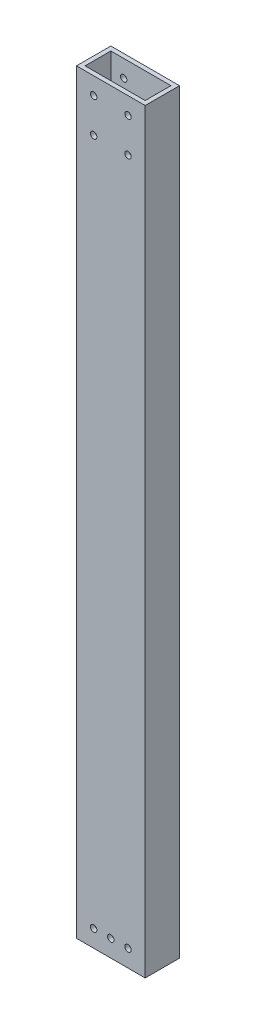
ISO-10303-21;
HEADER;
FILE_DESCRIPTION(('STEP AP214'),'2;1');
FILE_NAME('part.step','',(''),(''),'','','');
FILE_SCHEMA(('AUTOMOTIVE_DESIGN { 1 0 10303 214 1 1 1 1 }'));
ENDSEC;
DATA;
#1=APPLICATION_CONTEXT('core data for automotive mechanical design processes');
#2=APPLICATION_PROTOCOL_DEFINITION('international standard','automotive_design',2000,#1);
#3=PRODUCT_CONTEXT('',#1,'mechanical');
#4=PRODUCT('Part','Part','',(#3));
#5=PRODUCT_RELATED_PRODUCT_CATEGORY('part','',(#4));
#6=PRODUCT_DEFINITION_FORMATION('','',#4);
#7=PRODUCT_DEFINITION_CONTEXT('part definition',#1,'design');
#8=PRODUCT_DEFINITION('design','',#6,#7);
#9=PRODUCT_DEFINITION_SHAPE('','',#8);
#10=(LENGTH_UNIT() NAMED_UNIT(*) SI_UNIT(.MILLI.,.METRE.));
#11=(NAMED_UNIT(*) PLANE_ANGLE_UNIT() SI_UNIT($,.RADIAN.));
#12=(NAMED_UNIT(*) SI_UNIT($,.STERADIAN.) SOLID_ANGLE_UNIT());
#13=UNCERTAINTY_MEASURE_WITH_UNIT(LENGTH_MEASURE(1.E-05),#10,'distance_accuracy_value','');
#14=(GEOMETRIC_REPRESENTATION_CONTEXT(3) GLOBAL_UNCERTAINTY_ASSIGNED_CONTEXT((#13)) GLOBAL_UNIT_ASSIGNED_CONTEXT((#10,
#11,#12)) REPRESENTATION_CONTEXT('',''));
#15=CARTESIAN_POINT('',(0.,0.,0.));
#16=DIRECTION('',(0.,0.,1.));
#17=DIRECTION('',(1.,0.,0.));
#18=AXIS2_PLACEMENT_3D('',#15,#16,#17);
#19=CARTESIAN_POINT('',(0.,279.4,0.));
#20=DIRECTION('',(0.,-1.,0.));
#21=DIRECTION('',(0.,0.,-1.));
#22=AXIS2_PLACEMENT_3D('',#19,#20,#21);
#23=PLANE('',#22);
#24=DIRECTION('',(0.,0.,1.));
#25=VECTOR('',#24,1.);
#26=CARTESIAN_POINT('',(-25.4,279.4,-12.7));
#27=LINE('',#26,#25);
#28=CARTESIAN_POINT('',(-25.4,279.4,-12.7));
#29=VERTEX_POINT('',#28);
#30=CARTESIAN_POINT('',(-25.4,279.4,12.7));
#31=VERTEX_POINT('',#30);
#32=EDGE_CURVE('E136',#29,#31,#27,.T.);
#33=ORIENTED_EDGE('',*,*,#32,.T.);
#34=DIRECTION('',(1.,0.,0.));
#35=VECTOR('',#34,1.);
#36=CARTESIAN_POINT('',(25.4,279.4,12.7));
#37=LINE('',#36,#35);
#38=CARTESIAN_POINT('',(25.4,279.4,12.7));
#39=VERTEX_POINT('',#38);
#40=EDGE_CURVE('E139',#31,#39,#37,.T.);
#41=ORIENTED_EDGE('',*,*,#40,.T.);
#42=DIRECTION('',(0.,0.,-1.));
#43=VECTOR('',#42,1.);
#44=CARTESIAN_POINT('',(25.4,279.4,-12.7));
#45=LINE('',#44,#43);
#46=CARTESIAN_POINT('',(25.4,279.4,-12.7));
#47=VERTEX_POINT('',#46);
#48=EDGE_CURVE('E142',#39,#47,#45,.T.);
#49=ORIENTED_EDGE('',*,*,#48,.T.);
#50=DIRECTION('',(-1.,0.,0.));
#51=VECTOR('',#50,1.);
#52=CARTESIAN_POINT('',(25.4,279.4,-12.7));
#53=LINE('',#52,#51);
#54=EDGE_CURVE('E144',#47,#29,#53,.T.);
#55=ORIENTED_EDGE('',*,*,#54,.T.);
#56=EDGE_LOOP('',(#33,#41,#49,#55));
#57=FACE_BOUND('',#56,.T.);
#58=DIRECTION('',(0.,0.,1.));
#59=VECTOR('',#58,1.);
#60=CARTESIAN_POINT('',(-22.225,279.4,0.));
#61=LINE('',#60,#59);
#62=CARTESIAN_POINT('',(-22.225,279.4,-9.52500000000001));
#63=VERTEX_POINT('',#62);
#64=CARTESIAN_POINT('',(-22.225,279.4,9.52500000000001));
#65=VERTEX_POINT('',#64);
#66=EDGE_CURVE('E124',#63,#65,#61,.T.);
#67=ORIENTED_EDGE('',*,*,#66,.F.);
#68=DIRECTION('',(-1.,0.,0.));
#69=VECTOR('',#68,1.);
#70=CARTESIAN_POINT('',(0.,279.4,-9.52500000000001));
#71=LINE('',#70,#69);
#72=CARTESIAN_POINT('',(22.225,279.4,-9.52500000000001));
#73=VERTEX_POINT('',#72);
#74=EDGE_CURVE('E108',#73,#63,#71,.T.);
#75=ORIENTED_EDGE('',*,*,#74,.F.);
#76=DIRECTION('',(0.,0.,-1.));
#77=VECTOR('',#76,1.);
#78=CARTESIAN_POINT('',(22.225,279.4,0.));
#79=LINE('',#78,#77);
#80=CARTESIAN_POINT('',(22.225,279.4,9.52500000000001));
#81=VERTEX_POINT('',#80);
#82=EDGE_CURVE('E133',#81,#73,#79,.T.);
#83=ORIENTED_EDGE('',*,*,#82,.F.);
#84=DIRECTION('',(1.,0.,0.));
#85=VECTOR('',#84,1.);
#86=CARTESIAN_POINT('',(0.,279.4,9.52500000000001));
#87=LINE('',#86,#85);
#88=EDGE_CURVE('E126',#65,#81,#87,.T.);
#89=ORIENTED_EDGE('',*,*,#88,.F.);
#90=EDGE_LOOP('',(#67,#75,#83,#89));
#91=FACE_BOUND('',#90,.T.);
#92=ADVANCED_FACE('F36',(#57,#91),#23,.F.);
#93=CARTESIAN_POINT('',(0.,-279.4,0.));
#94=DIRECTION('',(0.,-1.,0.));
#95=DIRECTION('',(0.,0.,-1.));
#96=AXIS2_PLACEMENT_3D('',#93,#94,#95);
#97=PLANE('',#96);
#98=DIRECTION('',(0.,0.,1.));
#99=VECTOR('',#98,1.);
#100=CARTESIAN_POINT('',(-25.4,-279.4,-12.7));
#101=LINE('',#100,#99);
#102=CARTESIAN_POINT('',(-25.4,-279.4,-12.7));
#103=VERTEX_POINT('',#102);
#104=CARTESIAN_POINT('',(-25.4,-279.4,12.7));
#105=VERTEX_POINT('',#104);
#106=EDGE_CURVE('E147',#103,#105,#101,.T.);
#107=ORIENTED_EDGE('',*,*,#106,.F.);
#108=DIRECTION('',(-1.,0.,0.));
#109=VECTOR('',#108,1.);
#110=CARTESIAN_POINT('',(25.4,-279.4,-12.7));
#111=LINE('',#110,#109);
#112=CARTESIAN_POINT('',(25.4,-279.4,-12.7));
#113=VERTEX_POINT('',#112);
#114=EDGE_CURVE('E140',#113,#103,#111,.T.);
#115=ORIENTED_EDGE('',*,*,#114,.F.);
#116=DIRECTION('',(0.,0.,-1.));
#117=VECTOR('',#116,1.);
#118=CARTESIAN_POINT('',(25.4,-279.4,-12.7));
#119=LINE('',#118,#117);
#120=CARTESIAN_POINT('',(25.4,-279.4,12.7));
#121=VERTEX_POINT('',#120);
#122=EDGE_CURVE('E152',#121,#113,#119,.T.);
#123=ORIENTED_EDGE('',*,*,#122,.F.);
#124=DIRECTION('',(1.,0.,0.));
#125=VECTOR('',#124,1.);
#126=CARTESIAN_POINT('',(25.4,-279.4,12.7));
#127=LINE('',#126,#125);
#128=EDGE_CURVE('E150',#105,#121,#127,.T.);
#129=ORIENTED_EDGE('',*,*,#128,.F.);
#130=EDGE_LOOP('',(#107,#115,#123,#129));
#131=FACE_BOUND('',#130,.T.);
#132=DIRECTION('',(-1.,0.,0.));
#133=VECTOR('',#132,1.);
#134=CARTESIAN_POINT('',(0.,-279.4,-9.52500000000001));
#135=LINE('',#134,#133);
#136=CARTESIAN_POINT('',(22.225,-279.4,-9.52500000000001));
#137=VERTEX_POINT('',#136);
#138=CARTESIAN_POINT('',(-22.225,-279.4,-9.52500000000001));
#139=VERTEX_POINT('',#138);
#140=EDGE_CURVE('E106',#137,#139,#135,.T.);
#141=ORIENTED_EDGE('',*,*,#140,.T.);
#142=DIRECTION('',(0.,0.,1.));
#143=VECTOR('',#142,1.);
#144=CARTESIAN_POINT('',(-22.225,-279.4,0.));
#145=LINE('',#144,#143);
#146=CARTESIAN_POINT('',(-22.225,-279.4,9.52500000000001));
#147=VERTEX_POINT('',#146);
#148=EDGE_CURVE('E114',#139,#147,#145,.T.);
#149=ORIENTED_EDGE('',*,*,#148,.T.);
#150=DIRECTION('',(1.,0.,0.));
#151=VECTOR('',#150,1.);
#152=CARTESIAN_POINT('',(0.,-279.4,9.52500000000001));
#153=LINE('',#152,#151);
#154=CARTESIAN_POINT('',(22.225,-279.4,9.52500000000001));
#155=VERTEX_POINT('',#154);
#156=EDGE_CURVE('E120',#147,#155,#153,.T.);
#157=ORIENTED_EDGE('',*,*,#156,.T.);
#158=DIRECTION('',(0.,0.,-1.));
#159=VECTOR('',#158,1.);
#160=CARTESIAN_POINT('',(22.225,-279.4,0.));
#161=LINE('',#160,#159);
#162=EDGE_CURVE('E60',#155,#137,#161,.T.);
#163=ORIENTED_EDGE('',*,*,#162,.T.);
#164=EDGE_LOOP('',(#141,#149,#157,#163));
#165=FACE_BOUND('',#164,.T.);
#166=ADVANCED_FACE('F123',(#131,#165),#97,.T.);
#167=CARTESIAN_POINT('',(-25.4,279.4,-12.7));
#168=DIRECTION('',(1.,0.,0.));
#169=DIRECTION('',(0.,0.,-1.));
#170=AXIS2_PLACEMENT_3D('',#167,#168,#169);
#171=PLANE('',#170);
#172=ORIENTED_EDGE('',*,*,#106,.T.);
#173=DIRECTION('',(0.,-1.,0.));
#174=VECTOR('',#173,1.);
#175=CARTESIAN_POINT('',(-25.4,279.4,12.7));
#176=LINE('',#175,#174);
#177=EDGE_CURVE('E11',#31,#105,#176,.T.);
#178=ORIENTED_EDGE('',*,*,#177,.F.);
#179=ORIENTED_EDGE('',*,*,#32,.F.);
#180=DIRECTION('',(0.,-1.,0.));
#181=VECTOR('',#180,1.);
#182=CARTESIAN_POINT('',(-25.4,279.4,-12.7));
#183=LINE('',#182,#181);
#184=EDGE_CURVE('E146',#29,#103,#183,.T.);
#185=ORIENTED_EDGE('',*,*,#184,.T.);
#186=EDGE_LOOP('',(#172,#178,#179,#185));
#187=FACE_BOUND('',#186,.T.);
#188=ADVANCED_FACE('F38',(#187),#171,.F.);
#189=CARTESIAN_POINT('',(25.4,279.4,12.7));
#190=DIRECTION('',(0.,0.,-1.));
#191=DIRECTION('',(-1.,0.,0.));
#192=AXIS2_PLACEMENT_3D('',#189,#190,#191);
#193=PLANE('',#192);
#194=CARTESIAN_POINT('',(0.,-266.7,12.7));
#195=DIRECTION('',(0.,0.,-1.));
#196=DIRECTION('',(-1.,0.,0.));
#197=AXIS2_PLACEMENT_3D('',#194,#195,#196);
#198=CIRCLE('',#197,2.38125000000001);
#199=CARTESIAN_POINT('',(-2.38125000000001,-266.7,12.7));
#200=VERTEX_POINT('',#199);
#201=EDGE_CURVE('E246',#200,#200,#198,.T.);
#202=ORIENTED_EDGE('',*,*,#201,.T.);
#203=EDGE_LOOP('',(#202));
#204=FACE_BOUND('',#203,.T.);
#205=CARTESIAN_POINT('',(-12.7,-266.7,12.7));
#206=DIRECTION('',(0.,0.,-1.));
#207=DIRECTION('',(-1.,0.,0.));
#208=AXIS2_PLACEMENT_3D('',#205,#206,#207);
#209=CIRCLE('',#208,2.38125000000002);
#210=CARTESIAN_POINT('',(-15.08125,-266.7,12.7));
#211=VERTEX_POINT('',#210);
#212=EDGE_CURVE('E250',#211,#211,#209,.T.);
#213=ORIENTED_EDGE('',*,*,#212,.T.);
#214=EDGE_LOOP('',(#213));
#215=FACE_BOUND('',#214,.T.);
#216=CARTESIAN_POINT('',(12.7,266.7,12.7));
#217=DIRECTION('',(0.,0.,-1.));
#218=DIRECTION('',(-1.,0.,0.));
#219=AXIS2_PLACEMENT_3D('',#216,#217,#218);
#220=CIRCLE('',#219,2.38125000000004);
#221=CARTESIAN_POINT('',(10.31875,266.7,12.7));
#222=VERTEX_POINT('',#221);
#223=EDGE_CURVE('E254',#222,#222,#220,.T.);
#224=ORIENTED_EDGE('',*,*,#223,.T.);
#225=EDGE_LOOP('',(#224));
#226=FACE_BOUND('',#225,.T.);
#227=CARTESIAN_POINT('',(12.7,241.3,12.7));
#228=DIRECTION('',(0.,0.,-1.));
#229=DIRECTION('',(-1.,0.,0.));
#230=AXIS2_PLACEMENT_3D('',#227,#228,#229);
#231=CIRCLE('',#230,2.38125);
#232=CARTESIAN_POINT('',(10.31875,241.3,12.7));
#233=VERTEX_POINT('',#232);
#234=EDGE_CURVE('E258',#233,#233,#231,.T.);
#235=ORIENTED_EDGE('',*,*,#234,.T.);
#236=EDGE_LOOP('',(#235));
#237=FACE_BOUND('',#236,.T.);
#238=CARTESIAN_POINT('',(-12.7,241.3,12.7));
#239=DIRECTION('',(0.,0.,-1.));
#240=DIRECTION('',(-1.,0.,0.));
#241=AXIS2_PLACEMENT_3D('',#238,#239,#240);
#242=CIRCLE('',#241,2.38125);
#243=CARTESIAN_POINT('',(-15.08125,241.3,12.7));
#244=VERTEX_POINT('',#243);
#245=EDGE_CURVE('E262',#244,#244,#242,.T.);
#246=ORIENTED_EDGE('',*,*,#245,.T.);
#247=EDGE_LOOP('',(#246));
#248=FACE_BOUND('',#247,.T.);
#249=CARTESIAN_POINT('',(-12.7,266.7,12.7));
#250=DIRECTION('',(0.,0.,-1.));
#251=DIRECTION('',(-1.,0.,0.));
#252=AXIS2_PLACEMENT_3D('',#249,#250,#251);
#253=CIRCLE('',#252,2.38125000000004);
#254=CARTESIAN_POINT('',(-15.08125,266.7,12.7));
#255=VERTEX_POINT('',#254);
#256=EDGE_CURVE('E266',#255,#255,#253,.T.);
#257=ORIENTED_EDGE('',*,*,#256,.T.);
#258=EDGE_LOOP('',(#257));
#259=FACE_BOUND('',#258,.T.);
#260=CARTESIAN_POINT('',(12.7,-266.7,12.7));
#261=DIRECTION('',(0.,0.,-1.));
#262=DIRECTION('',(-1.,0.,0.));
#263=AXIS2_PLACEMENT_3D('',#260,#261,#262);
#264=CIRCLE('',#263,2.38125000000002);
#265=CARTESIAN_POINT('',(10.31875,-266.7,12.7));
#266=VERTEX_POINT('',#265);
#267=EDGE_CURVE('E166',#266,#266,#264,.T.);
#268=ORIENTED_EDGE('',*,*,#267,.T.);
#269=EDGE_LOOP('',(#268));
#270=FACE_BOUND('',#269,.T.);
#271=ORIENTED_EDGE('',*,*,#128,.T.);
#272=DIRECTION('',(0.,-1.,0.));
#273=VECTOR('',#272,1.);
#274=CARTESIAN_POINT('',(25.4,279.4,12.7));
#275=LINE('',#274,#273);
#276=EDGE_CURVE('E45',#39,#121,#275,.T.);
#277=ORIENTED_EDGE('',*,*,#276,.F.);
#278=ORIENTED_EDGE('',*,*,#40,.F.);
#279=ORIENTED_EDGE('',*,*,#177,.T.);
#280=EDGE_LOOP('',(#271,#277,#278,#279));
#281=FACE_BOUND('',#280,.T.);
#282=ADVANCED_FACE('F234',(#204,#215,#226,#237,#248,#259,#270,#281),#193,.F.);
#283=CARTESIAN_POINT('',(25.4,279.4,-12.7));
#284=DIRECTION('',(-1.,0.,0.));
#285=DIRECTION('',(0.,0.,1.));
#286=AXIS2_PLACEMENT_3D('',#283,#284,#285);
#287=PLANE('',#286);
#288=ORIENTED_EDGE('',*,*,#122,.T.);
#289=DIRECTION('',(0.,-1.,0.));
#290=VECTOR('',#289,1.);
#291=CARTESIAN_POINT('',(25.4,279.4,-12.7));
#292=LINE('',#291,#290);
#293=EDGE_CURVE('E157',#47,#113,#292,.T.);
#294=ORIENTED_EDGE('',*,*,#293,.F.);
#295=ORIENTED_EDGE('',*,*,#48,.F.);
#296=ORIENTED_EDGE('',*,*,#276,.T.);
#297=EDGE_LOOP('',(#288,#294,#295,#296));
#298=FACE_BOUND('',#297,.T.);
#299=ADVANCED_FACE('F231',(#298),#287,.F.);
#300=CARTESIAN_POINT('',(25.4,279.4,-12.7));
#301=DIRECTION('',(0.,0.,1.));
#302=DIRECTION('',(1.,0.,0.));
#303=AXIS2_PLACEMENT_3D('',#300,#301,#302);
#304=PLANE('',#303);
#305=CARTESIAN_POINT('',(0.,-266.7,-12.7));
#306=DIRECTION('',(0.,0.,-1.));
#307=DIRECTION('',(-1.,0.,0.));
#308=AXIS2_PLACEMENT_3D('',#305,#306,#307);
#309=CIRCLE('',#308,2.38125000000001);
#310=CARTESIAN_POINT('',(-2.38125000000001,-266.7,-12.7));
#311=VERTEX_POINT('',#310);
#312=EDGE_CURVE('E285',#311,#311,#309,.T.);
#313=ORIENTED_EDGE('',*,*,#312,.F.);
#314=EDGE_LOOP('',(#313));
#315=FACE_BOUND('',#314,.T.);
#316=CARTESIAN_POINT('',(-12.7,-266.7,-12.7));
#317=DIRECTION('',(0.,0.,-1.));
#318=DIRECTION('',(-1.,0.,0.));
#319=AXIS2_PLACEMENT_3D('',#316,#317,#318);
#320=CIRCLE('',#319,2.38125000000002);
#321=CARTESIAN_POINT('',(-15.08125,-266.7,-12.7));
#322=VERTEX_POINT('',#321);
#323=EDGE_CURVE('E362',#322,#322,#320,.T.);
#324=ORIENTED_EDGE('',*,*,#323,.F.);
#325=EDGE_LOOP('',(#324));
#326=FACE_BOUND('',#325,.T.);
#327=CARTESIAN_POINT('',(12.7,266.7,-12.7));
#328=DIRECTION('',(0.,0.,-1.));
#329=DIRECTION('',(-1.,0.,0.));
#330=AXIS2_PLACEMENT_3D('',#327,#328,#329);
#331=CIRCLE('',#330,2.38125000000004);
#332=CARTESIAN_POINT('',(10.31875,266.7,-12.7));
#333=VERTEX_POINT('',#332);
#334=EDGE_CURVE('E366',#333,#333,#331,.T.);
#335=ORIENTED_EDGE('',*,*,#334,.F.);
#336=EDGE_LOOP('',(#335));
#337=FACE_BOUND('',#336,.T.);
#338=CARTESIAN_POINT('',(12.7,241.3,-12.7));
#339=DIRECTION('',(0.,0.,-1.));
#340=DIRECTION('',(-1.,0.,0.));
#341=AXIS2_PLACEMENT_3D('',#338,#339,#340);
#342=CIRCLE('',#341,2.38125);
#343=CARTESIAN_POINT('',(10.31875,241.3,-12.7));
#344=VERTEX_POINT('',#343);
#345=EDGE_CURVE('E369',#344,#344,#342,.T.);
#346=ORIENTED_EDGE('',*,*,#345,.F.);
#347=EDGE_LOOP('',(#346));
#348=FACE_BOUND('',#347,.T.);
#349=CARTESIAN_POINT('',(-12.7,241.3,-12.7));
#350=DIRECTION('',(0.,0.,-1.));
#351=DIRECTION('',(-1.,0.,0.));
#352=AXIS2_PLACEMENT_3D('',#349,#350,#351);
#353=CIRCLE('',#352,2.38125);
#354=CARTESIAN_POINT('',(-15.08125,241.3,-12.7));
#355=VERTEX_POINT('',#354);
#356=EDGE_CURVE('E354',#355,#355,#353,.T.);
#357=ORIENTED_EDGE('',*,*,#356,.F.);
#358=EDGE_LOOP('',(#357));
#359=FACE_BOUND('',#358,.T.);
#360=CARTESIAN_POINT('',(-12.7,266.7,-12.7));
#361=DIRECTION('',(0.,0.,-1.));
#362=DIRECTION('',(-1.,0.,0.));
#363=AXIS2_PLACEMENT_3D('',#360,#361,#362);
#364=CIRCLE('',#363,2.38125000000004);
#365=CARTESIAN_POINT('',(-15.08125,266.7,-12.7));
#366=VERTEX_POINT('',#365);
#367=EDGE_CURVE('E351',#366,#366,#364,.T.);
#368=ORIENTED_EDGE('',*,*,#367,.F.);
#369=EDGE_LOOP('',(#368));
#370=FACE_BOUND('',#369,.T.);
#371=CARTESIAN_POINT('',(12.7,-266.7,-12.7));
#372=DIRECTION('',(0.,0.,-1.));
#373=DIRECTION('',(-1.,0.,0.));
#374=AXIS2_PLACEMENT_3D('',#371,#372,#373);
#375=CIRCLE('',#374,2.38125000000002);
#376=CARTESIAN_POINT('',(10.31875,-266.7,-12.7));
#377=VERTEX_POINT('',#376);
#378=EDGE_CURVE('E282',#377,#377,#375,.T.);
#379=ORIENTED_EDGE('',*,*,#378,.F.);
#380=EDGE_LOOP('',(#379));
#381=FACE_BOUND('',#380,.T.);
#382=ORIENTED_EDGE('',*,*,#114,.T.);
#383=ORIENTED_EDGE('',*,*,#184,.F.);
#384=ORIENTED_EDGE('',*,*,#54,.F.);
#385=ORIENTED_EDGE('',*,*,#293,.T.);
#386=EDGE_LOOP('',(#382,#383,#384,#385));
#387=FACE_BOUND('',#386,.T.);
#388=ADVANCED_FACE('F216',(#315,#326,#337,#348,#359,#370,#381,#387),#304,.F.);
#389=CARTESIAN_POINT('',(-22.225,279.4,-12.7));
#390=DIRECTION('',(1.,0.,0.));
#391=DIRECTION('',(0.,0.,-1.));
#392=AXIS2_PLACEMENT_3D('',#389,#390,#391);
#393=PLANE('',#392);
#394=ORIENTED_EDGE('',*,*,#148,.F.);
#395=DIRECTION('',(0.,-1.,0.));
#396=VECTOR('',#395,1.);
#397=CARTESIAN_POINT('',(-22.225,279.4,-9.52500000000001));
#398=LINE('',#397,#396);
#399=EDGE_CURVE('E102',#63,#139,#398,.T.);
#400=ORIENTED_EDGE('',*,*,#399,.F.);
#401=ORIENTED_EDGE('',*,*,#66,.T.);
#402=DIRECTION('',(0.,-1.,0.));
#403=VECTOR('',#402,1.);
#404=CARTESIAN_POINT('',(-22.225,279.4,9.52500000000001));
#405=LINE('',#404,#403);
#406=EDGE_CURVE('E117',#65,#147,#405,.T.);
#407=ORIENTED_EDGE('',*,*,#406,.T.);
#408=EDGE_LOOP('',(#394,#400,#401,#407));
#409=FACE_BOUND('',#408,.T.);
#410=ADVANCED_FACE('F115',(#409),#393,.T.);
#411=CARTESIAN_POINT('',(25.4,279.4,9.52500000000001));
#412=DIRECTION('',(0.,0.,-1.));
#413=DIRECTION('',(-1.,0.,0.));
#414=AXIS2_PLACEMENT_3D('',#411,#412,#413);
#415=PLANE('',#414);
#416=CARTESIAN_POINT('',(0.,-266.7,9.52500000000001));
#417=DIRECTION('',(0.,0.,-1.));
#418=DIRECTION('',(-1.,0.,0.));
#419=AXIS2_PLACEMENT_3D('',#416,#417,#418);
#420=CIRCLE('',#419,2.38125000000001);
#421=CARTESIAN_POINT('',(-2.38125000000001,-266.7,9.52500000000001));
#422=VERTEX_POINT('',#421);
#423=EDGE_CURVE('E121',#422,#422,#420,.T.);
#424=ORIENTED_EDGE('',*,*,#423,.F.);
#425=EDGE_LOOP('',(#424));
#426=FACE_BOUND('',#425,.T.);
#427=CARTESIAN_POINT('',(-12.7,-266.7,9.52500000000001));
#428=DIRECTION('',(0.,0.,-1.));
#429=DIRECTION('',(-1.,0.,0.));
#430=AXIS2_PLACEMENT_3D('',#427,#428,#429);
#431=CIRCLE('',#430,2.38125000000002);
#432=CARTESIAN_POINT('',(-15.08125,-266.7,9.52500000000001));
#433=VERTEX_POINT('',#432);
#434=EDGE_CURVE('E184',#433,#433,#431,.T.);
#435=ORIENTED_EDGE('',*,*,#434,.F.);
#436=EDGE_LOOP('',(#435));
#437=FACE_BOUND('',#436,.T.);
#438=CARTESIAN_POINT('',(12.7,266.7,9.52500000000001));
#439=DIRECTION('',(0.,0.,-1.));
#440=DIRECTION('',(-1.,0.,0.));
#441=AXIS2_PLACEMENT_3D('',#438,#439,#440);
#442=CIRCLE('',#441,2.38125000000004);
#443=CARTESIAN_POINT('',(10.31875,266.7,9.52500000000001));
#444=VERTEX_POINT('',#443);
#445=EDGE_CURVE('E181',#444,#444,#442,.T.);
#446=ORIENTED_EDGE('',*,*,#445,.F.);
#447=EDGE_LOOP('',(#446));
#448=FACE_BOUND('',#447,.T.);
#449=CARTESIAN_POINT('',(12.7,241.3,9.52500000000001));
#450=DIRECTION('',(0.,0.,-1.));
#451=DIRECTION('',(-1.,0.,0.));
#452=AXIS2_PLACEMENT_3D('',#449,#450,#451);
#453=CIRCLE('',#452,2.38125);
#454=CARTESIAN_POINT('',(10.31875,241.3,9.52500000000001));
#455=VERTEX_POINT('',#454);
#456=EDGE_CURVE('E178',#455,#455,#453,.T.);
#457=ORIENTED_EDGE('',*,*,#456,.F.);
#458=EDGE_LOOP('',(#457));
#459=FACE_BOUND('',#458,.T.);
#460=CARTESIAN_POINT('',(-12.7,241.3,9.52500000000001));
#461=DIRECTION('',(0.,0.,-1.));
#462=DIRECTION('',(-1.,0.,0.));
#463=AXIS2_PLACEMENT_3D('',#460,#461,#462);
#464=CIRCLE('',#463,2.38125);
#465=CARTESIAN_POINT('',(-15.08125,241.3,9.52500000000001));
#466=VERTEX_POINT('',#465);
#467=EDGE_CURVE('E174',#466,#466,#464,.T.);
#468=ORIENTED_EDGE('',*,*,#467,.F.);
#469=EDGE_LOOP('',(#468));
#470=FACE_BOUND('',#469,.T.);
#471=CARTESIAN_POINT('',(-12.7,266.7,9.52500000000001));
#472=DIRECTION('',(0.,0.,-1.));
#473=DIRECTION('',(-1.,0.,0.));
#474=AXIS2_PLACEMENT_3D('',#471,#472,#473);
#475=CIRCLE('',#474,2.38125000000004);
#476=CARTESIAN_POINT('',(-15.08125,266.7,9.52500000000001));
#477=VERTEX_POINT('',#476);
#478=EDGE_CURVE('E170',#477,#477,#475,.T.);
#479=ORIENTED_EDGE('',*,*,#478,.F.);
#480=EDGE_LOOP('',(#479));
#481=FACE_BOUND('',#480,.T.);
#482=CARTESIAN_POINT('',(12.7,-266.7,9.52500000000001));
#483=DIRECTION('',(0.,0.,-1.));
#484=DIRECTION('',(-1.,0.,0.));
#485=AXIS2_PLACEMENT_3D('',#482,#483,#484);
#486=CIRCLE('',#485,2.38125000000002);
#487=CARTESIAN_POINT('',(10.31875,-266.7,9.52500000000001));
#488=VERTEX_POINT('',#487);
#489=EDGE_CURVE('E165',#488,#488,#486,.T.);
#490=ORIENTED_EDGE('',*,*,#489,.F.);
#491=EDGE_LOOP('',(#490));
#492=FACE_BOUND('',#491,.T.);
#493=ORIENTED_EDGE('',*,*,#156,.F.);
#494=ORIENTED_EDGE('',*,*,#406,.F.);
#495=ORIENTED_EDGE('',*,*,#88,.T.);
#496=DIRECTION('',(0.,-1.,0.));
#497=VECTOR('',#496,1.);
#498=CARTESIAN_POINT('',(22.225,279.4,9.52500000000001));
#499=LINE('',#498,#497);
#500=EDGE_CURVE('E198',#81,#155,#499,.T.);
#501=ORIENTED_EDGE('',*,*,#500,.T.);
#502=EDGE_LOOP('',(#493,#494,#495,#501));
#503=FACE_BOUND('',#502,.T.);
#504=ADVANCED_FACE('F205',(#426,#437,#448,#459,#470,#481,#492,#503),#415,.T.);
#505=CARTESIAN_POINT('',(22.225,279.4,-12.7));
#506=DIRECTION('',(-1.,0.,0.));
#507=DIRECTION('',(0.,0.,1.));
#508=AXIS2_PLACEMENT_3D('',#505,#506,#507);
#509=PLANE('',#508);
#510=ORIENTED_EDGE('',*,*,#162,.F.);
#511=ORIENTED_EDGE('',*,*,#500,.F.);
#512=ORIENTED_EDGE('',*,*,#82,.T.);
#513=DIRECTION('',(0.,-1.,0.));
#514=VECTOR('',#513,1.);
#515=CARTESIAN_POINT('',(22.225,279.4,-9.52500000000001));
#516=LINE('',#515,#514);
#517=EDGE_CURVE('E53',#73,#137,#516,.T.);
#518=ORIENTED_EDGE('',*,*,#517,.T.);
#519=EDGE_LOOP('',(#510,#511,#512,#518));
#520=FACE_BOUND('',#519,.T.);
#521=ADVANCED_FACE('F200',(#520),#509,.T.);
#522=CARTESIAN_POINT('',(25.4,279.4,-9.52500000000001));
#523=DIRECTION('',(0.,0.,1.));
#524=DIRECTION('',(1.,0.,0.));
#525=AXIS2_PLACEMENT_3D('',#522,#523,#524);
#526=PLANE('',#525);
#527=CARTESIAN_POINT('',(0.,-266.7,-9.52500000000001));
#528=DIRECTION('',(0.,0.,1.));
#529=DIRECTION('',(1.,0.,0.));
#530=AXIS2_PLACEMENT_3D('',#527,#528,#529);
#531=CIRCLE('',#530,2.38125000000001);
#532=CARTESIAN_POINT('',(2.38125000000001,-266.7,-9.52500000000001));
#533=VERTEX_POINT('',#532);
#534=EDGE_CURVE('E40',#533,#533,#531,.T.);
#535=ORIENTED_EDGE('',*,*,#534,.F.);
#536=EDGE_LOOP('',(#535));
#537=FACE_BOUND('',#536,.T.);
#538=CARTESIAN_POINT('',(-12.7,-266.7,-9.52500000000001));
#539=DIRECTION('',(0.,0.,1.));
#540=DIRECTION('',(1.,0.,0.));
#541=AXIS2_PLACEMENT_3D('',#538,#539,#540);
#542=CIRCLE('',#541,2.38125000000002);
#543=CARTESIAN_POINT('',(-10.31875,-266.7,-9.52500000000001));
#544=VERTEX_POINT('',#543);
#545=EDGE_CURVE('E182',#544,#544,#542,.T.);
#546=ORIENTED_EDGE('',*,*,#545,.F.);
#547=EDGE_LOOP('',(#546));
#548=FACE_BOUND('',#547,.T.);
#549=CARTESIAN_POINT('',(12.7,266.7,-9.52500000000001));
#550=DIRECTION('',(0.,0.,1.));
#551=DIRECTION('',(1.,0.,0.));
#552=AXIS2_PLACEMENT_3D('',#549,#550,#551);
#553=CIRCLE('',#552,2.38125000000004);
#554=CARTESIAN_POINT('',(15.08125,266.7,-9.52500000000001));
#555=VERTEX_POINT('',#554);
#556=EDGE_CURVE('E179',#555,#555,#553,.T.);
#557=ORIENTED_EDGE('',*,*,#556,.F.);
#558=EDGE_LOOP('',(#557));
#559=FACE_BOUND('',#558,.T.);
#560=CARTESIAN_POINT('',(12.7,241.3,-9.52500000000001));
#561=DIRECTION('',(0.,0.,1.));
#562=DIRECTION('',(1.,0.,0.));
#563=AXIS2_PLACEMENT_3D('',#560,#561,#562);
#564=CIRCLE('',#563,2.38125);
#565=CARTESIAN_POINT('',(15.08125,241.3,-9.52500000000001));
#566=VERTEX_POINT('',#565);
#567=EDGE_CURVE('E175',#566,#566,#564,.T.);
#568=ORIENTED_EDGE('',*,*,#567,.F.);
#569=EDGE_LOOP('',(#568));
#570=FACE_BOUND('',#569,.T.);
#571=CARTESIAN_POINT('',(-12.7,241.3,-9.52500000000001));
#572=DIRECTION('',(0.,0.,1.));
#573=DIRECTION('',(1.,0.,0.));
#574=AXIS2_PLACEMENT_3D('',#571,#572,#573);
#575=CIRCLE('',#574,2.38125);
#576=CARTESIAN_POINT('',(-10.31875,241.3,-9.52500000000001));
#577=VERTEX_POINT('',#576);
#578=EDGE_CURVE('E171',#577,#577,#575,.T.);
#579=ORIENTED_EDGE('',*,*,#578,.F.);
#580=EDGE_LOOP('',(#579));
#581=FACE_BOUND('',#580,.T.);
#582=CARTESIAN_POINT('',(-12.7,266.7,-9.52500000000001));
#583=DIRECTION('',(0.,0.,1.));
#584=DIRECTION('',(1.,0.,0.));
#585=AXIS2_PLACEMENT_3D('',#582,#583,#584);
#586=CIRCLE('',#585,2.38125000000004);
#587=CARTESIAN_POINT('',(-10.31875,266.7,-9.52500000000001));
#588=VERTEX_POINT('',#587);
#589=EDGE_CURVE('E167',#588,#588,#586,.T.);
#590=ORIENTED_EDGE('',*,*,#589,.F.);
#591=EDGE_LOOP('',(#590));
#592=FACE_BOUND('',#591,.T.);
#593=CARTESIAN_POINT('',(12.7,-266.7,-9.52500000000001));
#594=DIRECTION('',(0.,0.,1.));
#595=DIRECTION('',(1.,0.,0.));
#596=AXIS2_PLACEMENT_3D('',#593,#594,#595);
#597=CIRCLE('',#596,2.38125000000002);
#598=CARTESIAN_POINT('',(15.08125,-266.7,-9.52500000000001));
#599=VERTEX_POINT('',#598);
#600=EDGE_CURVE('E162',#599,#599,#597,.T.);
#601=ORIENTED_EDGE('',*,*,#600,.F.);
#602=EDGE_LOOP('',(#601));
#603=FACE_BOUND('',#602,.T.);
#604=ORIENTED_EDGE('',*,*,#140,.F.);
#605=ORIENTED_EDGE('',*,*,#517,.F.);
#606=ORIENTED_EDGE('',*,*,#74,.T.);
#607=ORIENTED_EDGE('',*,*,#399,.T.);
#608=EDGE_LOOP('',(#604,#605,#606,#607));
#609=FACE_BOUND('',#608,.T.);
#610=ADVANCED_FACE('F104',(#537,#548,#559,#570,#581,#592,#603,#609),#526,.T.);
#611=CARTESIAN_POINT('',(12.7,-266.7,12.7));
#612=DIRECTION('',(0.,0.,-1.));
#613=DIRECTION('',(-1.,0.,0.));
#614=AXIS2_PLACEMENT_3D('',#611,#612,#613);
#615=CYLINDRICAL_SURFACE('',#614,2.38125000000002);
#616=ORIENTED_EDGE('',*,*,#600,.T.);
#617=EDGE_LOOP('',(#616));
#618=FACE_BOUND('',#617,.T.);
#619=ORIENTED_EDGE('',*,*,#378,.T.);
#620=EDGE_LOOP('',(#619));
#621=FACE_BOUND('',#620,.T.);
#622=ADVANCED_FACE('F309',(#618,#621),#615,.F.);
#623=CARTESIAN_POINT('',(-12.7,266.7,12.7));
#624=DIRECTION('',(0.,0.,-1.));
#625=DIRECTION('',(-1.,0.,0.));
#626=AXIS2_PLACEMENT_3D('',#623,#624,#625);
#627=CYLINDRICAL_SURFACE('',#626,2.38125000000004);
#628=ORIENTED_EDGE('',*,*,#589,.T.);
#629=EDGE_LOOP('',(#628));
#630=FACE_BOUND('',#629,.T.);
#631=ORIENTED_EDGE('',*,*,#367,.T.);
#632=EDGE_LOOP('',(#631));
#633=FACE_BOUND('',#632,.T.);
#634=ADVANCED_FACE('F316',(#630,#633),#627,.F.);
#635=CARTESIAN_POINT('',(-12.7,241.3,12.7));
#636=DIRECTION('',(0.,0.,-1.));
#637=DIRECTION('',(-1.,0.,0.));
#638=AXIS2_PLACEMENT_3D('',#635,#636,#637);
#639=CYLINDRICAL_SURFACE('',#638,2.38125);
#640=ORIENTED_EDGE('',*,*,#578,.T.);
#641=EDGE_LOOP('',(#640));
#642=FACE_BOUND('',#641,.T.);
#643=ORIENTED_EDGE('',*,*,#356,.T.);
#644=EDGE_LOOP('',(#643));
#645=FACE_BOUND('',#644,.T.);
#646=ADVANCED_FACE('F328',(#642,#645),#639,.F.);
#647=CARTESIAN_POINT('',(12.7,241.3,12.7));
#648=DIRECTION('',(0.,0.,-1.));
#649=DIRECTION('',(-1.,0.,0.));
#650=AXIS2_PLACEMENT_3D('',#647,#648,#649);
#651=CYLINDRICAL_SURFACE('',#650,2.38125);
#652=ORIENTED_EDGE('',*,*,#567,.T.);
#653=EDGE_LOOP('',(#652));
#654=FACE_BOUND('',#653,.T.);
#655=ORIENTED_EDGE('',*,*,#345,.T.);
#656=EDGE_LOOP('',(#655));
#657=FACE_BOUND('',#656,.T.);
#658=ADVANCED_FACE('F378',(#654,#657),#651,.F.);
#659=CARTESIAN_POINT('',(12.7,266.7,12.7));
#660=DIRECTION('',(0.,0.,-1.));
#661=DIRECTION('',(-1.,0.,0.));
#662=AXIS2_PLACEMENT_3D('',#659,#660,#661);
#663=CYLINDRICAL_SURFACE('',#662,2.38125000000004);
#664=ORIENTED_EDGE('',*,*,#556,.T.);
#665=EDGE_LOOP('',(#664));
#666=FACE_BOUND('',#665,.T.);
#667=ORIENTED_EDGE('',*,*,#334,.T.);
#668=EDGE_LOOP('',(#667));
#669=FACE_BOUND('',#668,.T.);
#670=ADVANCED_FACE('F384',(#666,#669),#663,.F.);
#671=CARTESIAN_POINT('',(-12.7,-266.7,12.7));
#672=DIRECTION('',(0.,0.,-1.));
#673=DIRECTION('',(-1.,0.,0.));
#674=AXIS2_PLACEMENT_3D('',#671,#672,#673);
#675=CYLINDRICAL_SURFACE('',#674,2.38125000000002);
#676=ORIENTED_EDGE('',*,*,#545,.T.);
#677=EDGE_LOOP('',(#676));
#678=FACE_BOUND('',#677,.T.);
#679=ORIENTED_EDGE('',*,*,#323,.T.);
#680=EDGE_LOOP('',(#679));
#681=FACE_BOUND('',#680,.T.);
#682=ADVANCED_FACE('F317',(#678,#681),#675,.F.);
#683=CARTESIAN_POINT('',(0.,-266.7,12.7));
#684=DIRECTION('',(0.,0.,-1.));
#685=DIRECTION('',(-1.,0.,0.));
#686=AXIS2_PLACEMENT_3D('',#683,#684,#685);
#687=CYLINDRICAL_SURFACE('',#686,2.38125000000001);
#688=ORIENTED_EDGE('',*,*,#534,.T.);
#689=EDGE_LOOP('',(#688));
#690=FACE_BOUND('',#689,.T.);
#691=ORIENTED_EDGE('',*,*,#312,.T.);
#692=EDGE_LOOP('',(#691));
#693=FACE_BOUND('',#692,.T.);
#694=ADVANCED_FACE('F307',(#690,#693),#687,.F.);
#695=ORIENTED_EDGE('',*,*,#489,.T.);
#696=EDGE_LOOP('',(#695));
#697=FACE_BOUND('',#696,.T.);
#698=ORIENTED_EDGE('',*,*,#267,.F.);
#699=EDGE_LOOP('',(#698));
#700=FACE_BOUND('',#699,.T.);
#701=ADVANCED_FACE('F304',(#697,#700),#615,.F.);
#702=ORIENTED_EDGE('',*,*,#478,.T.);
#703=EDGE_LOOP('',(#702));
#704=FACE_BOUND('',#703,.T.);
#705=ORIENTED_EDGE('',*,*,#256,.F.);
#706=EDGE_LOOP('',(#705));
#707=FACE_BOUND('',#706,.T.);
#708=ADVANCED_FACE('F306',(#704,#707),#627,.F.);
#709=ORIENTED_EDGE('',*,*,#467,.T.);
#710=EDGE_LOOP('',(#709));
#711=FACE_BOUND('',#710,.T.);
#712=ORIENTED_EDGE('',*,*,#245,.F.);
#713=EDGE_LOOP('',(#712));
#714=FACE_BOUND('',#713,.T.);
#715=ADVANCED_FACE('F296',(#711,#714),#639,.F.);
#716=ORIENTED_EDGE('',*,*,#456,.T.);
#717=EDGE_LOOP('',(#716));
#718=FACE_BOUND('',#717,.T.);
#719=ORIENTED_EDGE('',*,*,#234,.F.);
#720=EDGE_LOOP('',(#719));
#721=FACE_BOUND('',#720,.T.);
#722=ADVANCED_FACE('F386',(#718,#721),#651,.F.);
#723=ORIENTED_EDGE('',*,*,#445,.T.);
#724=EDGE_LOOP('',(#723));
#725=FACE_BOUND('',#724,.T.);
#726=ORIENTED_EDGE('',*,*,#223,.F.);
#727=EDGE_LOOP('',(#726));
#728=FACE_BOUND('',#727,.T.);
#729=ADVANCED_FACE('F391',(#725,#728),#663,.F.);
#730=ORIENTED_EDGE('',*,*,#434,.T.);
#731=EDGE_LOOP('',(#730));
#732=FACE_BOUND('',#731,.T.);
#733=ORIENTED_EDGE('',*,*,#212,.F.);
#734=EDGE_LOOP('',(#733));
#735=FACE_BOUND('',#734,.T.);
#736=ADVANCED_FACE('F396',(#732,#735),#675,.F.);
#737=ORIENTED_EDGE('',*,*,#423,.T.);
#738=EDGE_LOOP('',(#737));
#739=FACE_BOUND('',#738,.T.);
#740=ORIENTED_EDGE('',*,*,#201,.F.);
#741=EDGE_LOOP('',(#740));
#742=FACE_BOUND('',#741,.T.);
#743=ADVANCED_FACE('F320',(#739,#742),#687,.F.);
#744=CLOSED_SHELL('',(#92,#166,#188,#282,#299,#388,#410,#504,#521,#610,#622,#634,#646,#658,#670,
#682,#694,#701,#708,#715,#722,#729,#736,#743));
#745=MANIFOLD_SOLID_BREP('B2',#744);
#746=ADVANCED_BREP_SHAPE_REPRESENTATION('',(#18,#745),#14);
#747=SHAPE_DEFINITION_REPRESENTATION(#9,#746);
ENDSEC;
END-ISO-10303-21;
